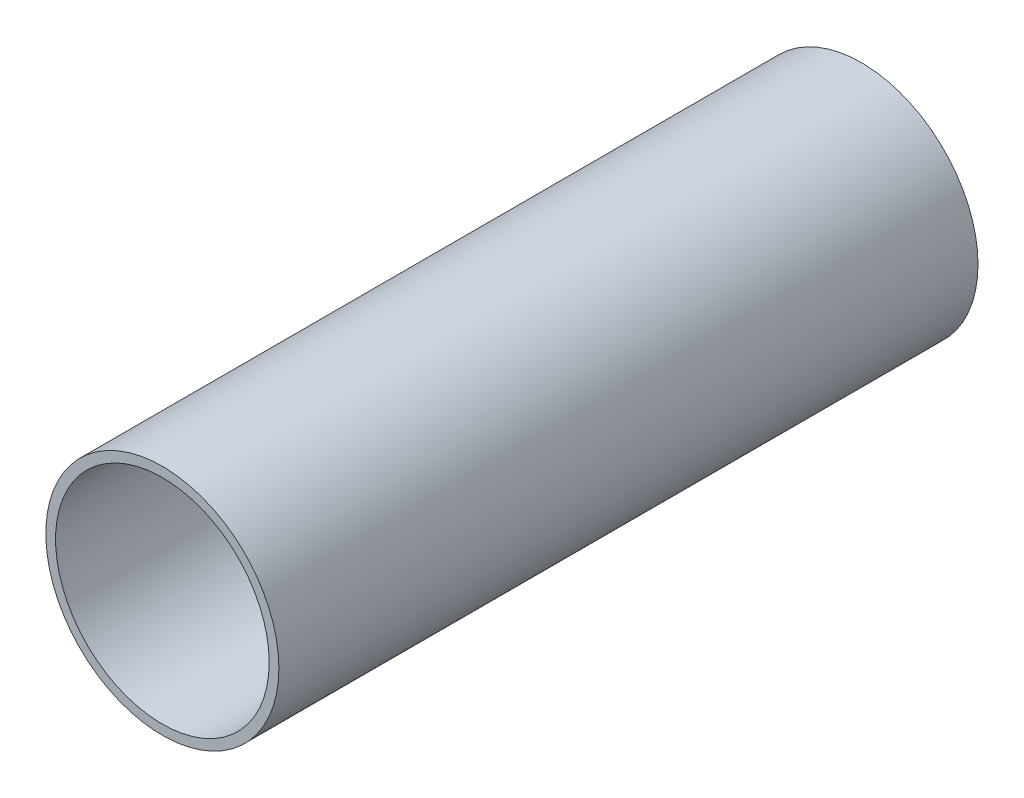
ISO-10303-21;
HEADER;
FILE_DESCRIPTION(('STEP AP214'),'2;1');
FILE_NAME('part.step','',(''),(''),'','','');
FILE_SCHEMA(('AUTOMOTIVE_DESIGN { 1 0 10303 214 1 1 1 1 }'));
ENDSEC;
DATA;
#1=APPLICATION_CONTEXT('core data for automotive mechanical design processes');
#2=APPLICATION_PROTOCOL_DEFINITION('international standard','automotive_design',2000,#1);
#3=PRODUCT_CONTEXT('',#1,'mechanical');
#4=PRODUCT('Part','Part','',(#3));
#5=PRODUCT_RELATED_PRODUCT_CATEGORY('part','',(#4));
#6=PRODUCT_DEFINITION_FORMATION('','',#4);
#7=PRODUCT_DEFINITION_CONTEXT('part definition',#1,'design');
#8=PRODUCT_DEFINITION('design','',#6,#7);
#9=PRODUCT_DEFINITION_SHAPE('','',#8);
#10=(LENGTH_UNIT() NAMED_UNIT(*) SI_UNIT(.MILLI.,.METRE.));
#11=(NAMED_UNIT(*) PLANE_ANGLE_UNIT() SI_UNIT($,.RADIAN.));
#12=(NAMED_UNIT(*) SI_UNIT($,.STERADIAN.) SOLID_ANGLE_UNIT());
#13=UNCERTAINTY_MEASURE_WITH_UNIT(LENGTH_MEASURE(1.E-05),#10,'distance_accuracy_value','');
#14=(GEOMETRIC_REPRESENTATION_CONTEXT(3) GLOBAL_UNCERTAINTY_ASSIGNED_CONTEXT((#13)) GLOBAL_UNIT_ASSIGNED_CONTEXT((#10,
#11,#12)) REPRESENTATION_CONTEXT('',''));
#15=CARTESIAN_POINT('',(0.,0.,0.));
#16=DIRECTION('',(0.,0.,1.));
#17=DIRECTION('',(1.,0.,0.));
#18=AXIS2_PLACEMENT_3D('',#15,#16,#17);
#19=CARTESIAN_POINT('',(0.,0.,228.6));
#20=DIRECTION('',(0.,0.,1.));
#21=DIRECTION('',(1.,0.,0.));
#22=AXIS2_PLACEMENT_3D('',#19,#20,#21);
#23=PLANE('',#22);
#24=CARTESIAN_POINT('',(0.,0.,228.6));
#25=DIRECTION('',(0.,0.,1.));
#26=DIRECTION('',(1.,0.,0.));
#27=AXIS2_PLACEMENT_3D('',#24,#25,#26);
#28=CIRCLE('',#27,38.1);
#29=CARTESIAN_POINT('',(38.1,0.,228.6));
#30=VERTEX_POINT('',#29);
#31=EDGE_CURVE('E10',#30,#30,#28,.T.);
#32=ORIENTED_EDGE('',*,*,#31,.T.);
#33=EDGE_LOOP('',(#32));
#34=FACE_BOUND('',#33,.T.);
#35=CARTESIAN_POINT('',(0.,0.,228.6));
#36=DIRECTION('',(0.,0.,1.));
#37=DIRECTION('',(1.,0.,0.));
#38=AXIS2_PLACEMENT_3D('',#35,#36,#37);
#39=CIRCLE('',#38,34.925);
#40=CARTESIAN_POINT('',(34.925,0.,228.6));
#41=VERTEX_POINT('',#40);
#42=EDGE_CURVE('E48',#41,#41,#39,.T.);
#43=ORIENTED_EDGE('',*,*,#42,.F.);
#44=EDGE_LOOP('',(#43));
#45=FACE_BOUND('',#44,.T.);
#46=ADVANCED_FACE('F30',(#34,#45),#23,.T.);
#47=CARTESIAN_POINT('',(0.,0.,0.));
#48=DIRECTION('',(0.,0.,1.));
#49=DIRECTION('',(1.,0.,0.));
#50=AXIS2_PLACEMENT_3D('',#47,#48,#49);
#51=PLANE('',#50);
#52=CARTESIAN_POINT('',(0.,0.,0.));
#53=DIRECTION('',(0.,0.,1.));
#54=DIRECTION('',(1.,0.,0.));
#55=AXIS2_PLACEMENT_3D('',#52,#53,#54);
#56=CIRCLE('',#55,38.1);
#57=CARTESIAN_POINT('',(38.1,0.,0.));
#58=VERTEX_POINT('',#57);
#59=EDGE_CURVE('E43',#58,#58,#56,.T.);
#60=ORIENTED_EDGE('',*,*,#59,.F.);
#61=EDGE_LOOP('',(#60));
#62=FACE_BOUND('',#61,.T.);
#63=CARTESIAN_POINT('',(0.,0.,0.));
#64=DIRECTION('',(0.,0.,1.));
#65=DIRECTION('',(1.,0.,0.));
#66=AXIS2_PLACEMENT_3D('',#63,#64,#65);
#67=CIRCLE('',#66,34.925);
#68=CARTESIAN_POINT('',(34.925,0.,0.));
#69=VERTEX_POINT('',#68);
#70=EDGE_CURVE('E51',#69,#69,#67,.T.);
#71=ORIENTED_EDGE('',*,*,#70,.T.);
#72=EDGE_LOOP('',(#71));
#73=FACE_BOUND('',#72,.T.);
#74=ADVANCED_FACE('F84',(#62,#73),#51,.F.);
#75=CARTESIAN_POINT('',(0.,0.,228.6));
#76=DIRECTION('',(0.,0.,-1.));
#77=DIRECTION('',(-1.,0.,0.));
#78=AXIS2_PLACEMENT_3D('',#75,#76,#77);
#79=CYLINDRICAL_SURFACE('',#78,38.1);
#80=CARTESIAN_POINT('',(0.,-38.1,73.6311199578352));
#81=CARTESIAN_POINT('',(-0.153999378052327,-38.1000006909333,73.5446645368232));
#82=CARTESIAN_POINT('',(-0.311575908863025,-38.0990649630533,73.4646590779705));
#83=CARTESIAN_POINT('',(-0.632872953058535,-38.0950819009941,73.3180411913921));
#84=CARTESIAN_POINT('',(-0.796594572800591,-38.0920341848326,73.2514311892327));
#85=CARTESIAN_POINT('',(-1.12905176057051,-38.0836304747435,73.1320723180007));
#86=CARTESIAN_POINT('',(-1.29778997944636,-38.0782732394959,73.0793309276057));
#87=CARTESIAN_POINT('',(-1.63904885419945,-38.0651110933928,72.9880964531141));
#88=CARTESIAN_POINT('',(-1.8115708515304,-38.0573053009703,72.949608511662));
#89=CARTESIAN_POINT('',(-2.15896002044526,-38.0391787479879,72.8871819588805));
#90=CARTESIAN_POINT('',(-2.33382530257213,-38.0288599105558,72.8632322707513));
#91=CARTESIAN_POINT('',(-2.68484040782847,-38.0056914098195,72.8299642402991));
#92=CARTESIAN_POINT('',(-2.86099068065575,-37.9928408151111,72.8206512940176));
#93=CARTESIAN_POINT('',(-3.21316536714221,-37.9646777614922,72.8166953335036));
#94=CARTESIAN_POINT('',(-3.38918979858104,-37.9493665877811,72.8220446842148));
#95=CARTESIAN_POINT('',(-3.74003345911291,-37.9163975996776,72.8473115973282));
#96=CARTESIAN_POINT('',(-3.91485221510293,-37.8987389137394,72.8672345828204));
#97=CARTESIAN_POINT('',(-4.26245012904982,-37.8612223228919,72.9215291311543));
#98=CARTESIAN_POINT('',(-4.43522298815622,-37.8413589528043,72.955937217845));
#99=CARTESIAN_POINT('',(-4.77715998610147,-37.7997145452739,73.0389278820598));
#100=CARTESIAN_POINT('',(-4.94632277795876,-37.7779328070738,73.0875156543764));
#101=CARTESIAN_POINT('',(-5.27979912379681,-37.7327712743174,73.1984646479457));
#102=CARTESIAN_POINT('',(-5.44411391484604,-37.7093918925719,73.2608223204544));
#103=CARTESIAN_POINT('',(-5.7669190811532,-37.6613765735234,73.398882592438));
#104=CARTESIAN_POINT('',(-5.92540725230392,-37.6367401689571,73.4745901804361));
#105=CARTESIAN_POINT('',(-6.23807992231855,-37.5861924166831,73.6401876820523));
#106=CARTESIAN_POINT('',(-6.39214702265679,-37.5602665863988,73.7302949319848));
#107=CARTESIAN_POINT('',(-6.69215631411518,-37.5079757415019,73.9231461647893));
#108=CARTESIAN_POINT('',(-6.83809545878242,-37.4816105669645,74.0258948401241));
#109=CARTESIAN_POINT('',(-7.12078614309139,-37.4289335803583,74.2432945780046));
#110=CARTESIAN_POINT('',(-7.25754013123958,-37.4026217558962,74.3579424476489));
#111=CARTESIAN_POINT('',(-7.52099553388245,-37.3505379339371,74.5983939857302));
#112=CARTESIAN_POINT('',(-7.64769320740442,-37.3247661399323,74.7242017691691));
#113=CARTESIAN_POINT('',(-8.01402776043891,-37.2484624086954,75.1200988035967));
#114=CARTESIAN_POINT('',(-8.23694111911041,-37.1995082175912,75.4063834490837));
#115=CARTESIAN_POINT('',(-8.63118525328118,-37.1100222125439,76.0134231874334));
#116=CARTESIAN_POINT('',(-8.80252058023413,-37.0694896555396,76.3341752353619));
#117=CARTESIAN_POINT('',(-9.08634477495745,-37.0009396354387,76.9968588792698));
#118=CARTESIAN_POINT('',(-9.1996316423023,-36.9727532777437,77.3384267716486));
#119=CARTESIAN_POINT('',(-9.32516654640346,-36.9412100478409,77.8616611028286));
#120=CARTESIAN_POINT('',(-9.3596169303931,-36.932483747788,78.0379554415339));
#121=CARTESIAN_POINT('',(-9.41349561652424,-36.9187873672256,78.3929680085238));
#122=CARTESIAN_POINT('',(-9.43292422268371,-36.9138172106974,78.5716861876791));
#123=CARTESIAN_POINT('',(-9.46764718341471,-36.9049397994026,79.0994140576313));
#124=CARTESIAN_POINT('',(-9.46178410124502,-36.9064499527265,79.4501574072559));
#125=CARTESIAN_POINT('',(-9.39255680426464,-36.9241252111711,80.1453356042854));
#126=CARTESIAN_POINT('',(-9.32919548164796,-36.9402895791765,80.4897707681067));
#127=CARTESIAN_POINT('',(-9.14785709918977,-36.9856093311491,81.1601609246861));
#128=CARTESIAN_POINT('',(-9.0303088354965,-37.0146626545687,81.486238856995));
#129=CARTESIAN_POINT('',(-8.7443852096004,-37.0832472464911,82.1140754105058));
#130=CARTESIAN_POINT('',(-8.57600410340545,-37.1227796990493,82.4158312784866));
#131=CARTESIAN_POINT('',(-8.18908611193499,-37.2100647418452,82.9935926993617));
#132=CARTESIAN_POINT('',(-7.9695435253692,-37.257976578916,83.2689004472914));
#133=CARTESIAN_POINT('',(-7.48848364695595,-37.3576343610282,83.7792150135895));
#134=CARTESIAN_POINT('',(-7.22696004329372,-37.4093808819805,84.014215760823));
#135=CARTESIAN_POINT('',(-6.66180262345533,-37.5141956078285,84.4432236929521));
#136=CARTESIAN_POINT('',(-6.35728256110621,-37.5672646458032,84.6360647086473));
#137=CARTESIAN_POINT('',(-5.7195314684234,-37.6696316412794,84.967748482377));
#138=CARTESIAN_POINT('',(-5.38629996172652,-37.7189295361866,85.1065903442789));
#139=CARTESIAN_POINT('',(-4.69974058689894,-37.8106129356152,85.3262225539002));
#140=CARTESIAN_POINT('',(-4.3463840862277,-37.8529882421628,85.4069278438228));
#141=CARTESIAN_POINT('',(-3.63012216349652,-37.928377198642,85.5071269839308));
#142=CARTESIAN_POINT('',(-3.26721782057237,-37.9613919016219,85.5266277219872));
#143=CARTESIAN_POINT('',(-2.54890542921028,-38.016320282055,85.503593190175));
#144=CARTESIAN_POINT('',(-2.19347684778802,-38.0384171792293,85.4621317967447));
#145=CARTESIAN_POINT('',(-1.49415960663936,-38.0723004457395,85.3200083997401));
#146=CARTESIAN_POINT('',(-1.1502701845108,-38.0840874975508,85.2193503155155));
#147=CARTESIAN_POINT('',(-0.488026852508964,-38.0982988830021,84.9631411670524));
#148=CARTESIAN_POINT('',(-0.169422000252762,-38.1008307585192,84.8082436831507));
#149=CARTESIAN_POINT('',(0.437634032442004,-38.098697208265,84.4477051456771));
#150=CARTESIAN_POINT('',(0.726084483562315,-38.0940316084576,84.2420628651889));
#151=CARTESIAN_POINT('',(1.26582056716772,-38.0799292743434,83.7849723258831));
#152=CARTESIAN_POINT('',(1.51695501608155,-38.0704737810151,83.5333464741751));
#153=CARTESIAN_POINT('',(1.97384478869089,-38.0495256726533,82.9916452718162));
#154=CARTESIAN_POINT('',(2.17959815701733,-38.0380329698795,82.7015682652531));
#155=CARTESIAN_POINT('',(2.45039481566481,-38.0212283194731,82.2429708149471));
#156=CARTESIAN_POINT('',(2.53462667505797,-38.0156768714179,82.0854825869865));
#157=CARTESIAN_POINT('',(2.6895340604357,-38.0050317848892,81.7639787390124));
#158=CARTESIAN_POINT('',(2.76021453192334,-37.9999379797634,81.5999655267423));
#159=CARTESIAN_POINT('',(2.88753597174662,-37.9904753261929,81.266501236459));
#160=CARTESIAN_POINT('',(2.94417182463346,-37.9861067420852,81.0970482024149));
#161=CARTESIAN_POINT('',(3.04295598768016,-37.9783211209706,80.7540142097206));
#162=CARTESIAN_POINT('',(3.08510969933637,-37.9749037292818,80.5804348159887));
#163=CARTESIAN_POINT('',(3.15465150399311,-37.9691900511137,80.2303217698206));
#164=CARTESIAN_POINT('',(3.18203931205294,-37.9668937862689,80.0537880604422));
#165=CARTESIAN_POINT('',(3.22184198507673,-37.9635369008799,79.6990950553072));
#166=CARTESIAN_POINT('',(3.23426240644717,-37.9624758217974,79.5209363875541));
#167=CARTESIAN_POINT('',(3.24405948604171,-37.961639882355,79.1641444799897));
#168=CARTESIAN_POINT('',(3.24143122130589,-37.9618654429006,78.9855111039886));
#169=CARTESIAN_POINT('',(3.22114249436632,-37.9635923494258,78.6291728140594));
#170=CARTESIAN_POINT('',(3.20348760808168,-37.9650932221757,78.4514675803326));
#171=CARTESIAN_POINT('',(3.15335083400245,-37.9692903272751,78.0986735027199));
#172=CARTESIAN_POINT('',(3.12090974217402,-37.9719832700521,77.9235788199462));
#173=CARTESIAN_POINT('',(3.04146227953345,-37.9784293099445,77.5768137906815));
#174=CARTESIAN_POINT('',(2.99446127085378,-37.9821820167247,77.4051422082625));
#175=CARTESIAN_POINT('',(2.88619613944338,-37.9905622305655,77.0662716237174));
#176=CARTESIAN_POINT('',(2.82492391852134,-37.9951902340313,76.8990752213133));
#177=CARTESIAN_POINT('',(2.68859234615582,-38.0050804128912,76.5704927274893));
#178=CARTESIAN_POINT('',(2.6135380130281,-38.010342357217,76.4091045466901));
#179=CARTESIAN_POINT('',(2.44991908445536,-38.0212392536823,76.0927449541293));
#180=CARTESIAN_POINT('',(2.36131583523157,-38.0268752460477,75.93779356746));
#181=CARTESIAN_POINT('',(2.17142053725815,-38.0381909866425,75.6359531433555));
#182=CARTESIAN_POINT('',(2.07013306934408,-38.0438707183842,75.4890612226928));
#183=CARTESIAN_POINT('',(1.85561481607758,-38.0549367857685,75.2043946672279));
#184=CARTESIAN_POINT('',(1.74239130755095,-38.0603232971702,75.0666145598281));
#185=CARTESIAN_POINT('',(1.5047875044797,-38.0704577953839,74.8010861816336));
#186=CARTESIAN_POINT('',(1.38040935709391,-38.0752059046441,74.6733359890194));
#187=CARTESIAN_POINT('',(1.06227236387619,-38.0856552035965,74.3729829759868));
#188=CARTESIAN_POINT('',(0.862710023250818,-38.0908058890111,74.206444683907));
#189=CARTESIAN_POINT('',(0.444670789149229,-38.0979777701363,73.8990060381876));
#190=CARTESIAN_POINT('',(0.226194012399342,-38.0999989851585,73.7581055263467));
#191=CARTESIAN_POINT('',(0.,-38.1,73.6311199578352));
#192=B_SPLINE_CURVE_WITH_KNOTS('',3,(#80,#81,#82,#83,#84,#85,#86,#87,#88,#89,#90,#91,#92,#93,
#94,#95,#96,#97,#98,#99,#100,#101,#102,#103,#104,#105,#106,#107,#108,#109,#110,#111,#112,#113,
#114,#115,#116,#117,#118,#119,#120,#121,#122,#123,#124,#125,#126,#127,#128,#129,#130,#131,#132,
#133,#134,#135,#136,#137,#138,#139,#140,#141,#142,#143,#144,#145,#146,#147,#148,#149,#150,#151,
#152,#153,#154,#155,#156,#157,#158,#159,#160,#161,#162,#163,#164,#165,#166,#167,#168,#169,#170,
#171,#172,#173,#174,#175,#176,#177,#178,#179,#180,#181,#182,#183,#184,#185,#186,#187,#188,#189,
#190,#191),.UNSPECIFIED.,.T.,.F.,(4,2,2,2,2,2,2,2,2,2,2,2,2,2,2,2,2,2,2,2,2,2,2,2,2,2,2,2,2,2,2,
2,2,2,2,2,2,2,2,2,2,2,2,2,2,2,2,2,2,2,2,2,2,2,2,4),(0.,0.529600927673914,1.05929766602483,
1.58927946137443,2.11945228829836,2.64922066406384,3.17918430064054,3.70887202318625,
4.23875695160836,4.76998605184196,5.30141001511656,5.8326971806578,6.36418329701175,
6.90461852167121,7.44525496311512,7.98574670923578,8.52643858628468,9.61902699166447,
10.7115189543524,11.7885596948404,12.3274903040822,12.8664100059015,13.9132926300962,
14.9601225984213,15.9988072778133,17.0376093700998,18.0988713033108,19.16029294617,
20.2481384826609,21.3360020715139,22.4254540646015,23.5147834479539,24.5851522161598,
25.6554501243706,26.7132712916366,27.7711180375861,28.8331401131608,29.8952079399513,
30.4307414563624,30.9660791592473,31.5016115618737,32.0369440061732,32.5722867805243,
33.1074307560216,33.6427498061278,34.1778703022857,34.7115232259393,35.2449798488446,
35.7787399220914,36.3123060276628,36.8474237691893,37.3823488102231,37.9169495989458,
38.4514477022155,39.2293294023994,40.0072063023975),.UNSPECIFIED.);
#193=CARTESIAN_POINT('',(0.,-38.1,73.6311199578352));
#194=VERTEX_POINT('',#193);
#195=EDGE_CURVE('E74',#194,#194,#192,.T.);
#196=ORIENTED_EDGE('',*,*,#195,.T.);
#197=EDGE_LOOP('',(#196));
#198=FACE_BOUND('',#197,.T.);
#199=CARTESIAN_POINT('',(0.,-38.1,149.831119957835));
#200=CARTESIAN_POINT('',(-0.153999378052327,-38.1000006909333,149.744664536823));
#201=CARTESIAN_POINT('',(-0.311575908863022,-38.0990649630533,149.66465907797));
#202=CARTESIAN_POINT('',(-0.632872953058529,-38.0950819009941,149.518041191392));
#203=CARTESIAN_POINT('',(-0.796594572800584,-38.0920341848326,149.451431189233));
#204=CARTESIAN_POINT('',(-1.12905176057051,-38.0836304747435,149.332072318001));
#205=CARTESIAN_POINT('',(-1.29778997944636,-38.0782732394959,149.279330927606));
#206=CARTESIAN_POINT('',(-1.63904885419944,-38.0651110933928,149.188096453114));
#207=CARTESIAN_POINT('',(-1.8115708515304,-38.0573053009703,149.149608511662));
#208=CARTESIAN_POINT('',(-2.15896002044526,-38.0391787479879,149.08718195888));
#209=CARTESIAN_POINT('',(-2.33382530257212,-38.0288599105558,149.063232270751));
#210=CARTESIAN_POINT('',(-2.68484040782846,-38.0056914098195,149.029964240299));
#211=CARTESIAN_POINT('',(-2.86099068065574,-37.9928408151111,149.020651294018));
#212=CARTESIAN_POINT('',(-3.21316536714221,-37.9646777614923,149.016695333504));
#213=CARTESIAN_POINT('',(-3.38918979858104,-37.9493665877811,149.022044684215));
#214=CARTESIAN_POINT('',(-3.74003345911291,-37.9163975996776,149.047311597328));
#215=CARTESIAN_POINT('',(-3.91485221510293,-37.8987389137394,149.06723458282));
#216=CARTESIAN_POINT('',(-4.26245012904982,-37.8612223228919,149.121529131154));
#217=CARTESIAN_POINT('',(-4.43522298815622,-37.8413589528043,149.155937217845));
#218=CARTESIAN_POINT('',(-4.77715998610147,-37.7997145452739,149.23892788206));
#219=CARTESIAN_POINT('',(-4.94632277795877,-37.7779328070738,149.287515654376));
#220=CARTESIAN_POINT('',(-5.27979912379681,-37.7327712743174,149.398464647946));
#221=CARTESIAN_POINT('',(-5.44411391484603,-37.7093918925719,149.460822320454));
#222=CARTESIAN_POINT('',(-5.76691908115319,-37.6613765735234,149.598882592438));
#223=CARTESIAN_POINT('',(-5.92540725230391,-37.6367401689571,149.674590180436));
#224=CARTESIAN_POINT('',(-6.23807992231855,-37.5861924166831,149.840187682052));
#225=CARTESIAN_POINT('',(-6.39214702265678,-37.5602665863988,149.930294931985));
#226=CARTESIAN_POINT('',(-6.69215631411516,-37.5079757415019,150.123146164789));
#227=CARTESIAN_POINT('',(-6.83809545878241,-37.4816105669645,150.225894840124));
#228=CARTESIAN_POINT('',(-7.12078614309138,-37.4289335803583,150.443294578005));
#229=CARTESIAN_POINT('',(-7.25754013123957,-37.4026217558962,150.557942447649));
#230=CARTESIAN_POINT('',(-7.52099553388244,-37.3505379339371,150.79839398573));
#231=CARTESIAN_POINT('',(-7.64769320740442,-37.3247661399323,150.924201769169));
#232=CARTESIAN_POINT('',(-8.01402776043892,-37.2484624086954,151.320098803597));
#233=CARTESIAN_POINT('',(-8.23694111911044,-37.1995082175912,151.606383449084));
#234=CARTESIAN_POINT('',(-8.6311852532812,-37.1100222125439,152.213423187434));
#235=CARTESIAN_POINT('',(-8.80252058023414,-37.0694896555396,152.534175235362));
#236=CARTESIAN_POINT('',(-9.08634477495745,-37.0009396354387,153.19685887927));
#237=CARTESIAN_POINT('',(-9.1996316423023,-36.9727532777436,153.538426771649));
#238=CARTESIAN_POINT('',(-9.32516654640346,-36.9412100478409,154.061661102829));
#239=CARTESIAN_POINT('',(-9.3596169303931,-36.932483747788,154.237955441534));
#240=CARTESIAN_POINT('',(-9.41349561652424,-36.9187873672256,154.592968008524));
#241=CARTESIAN_POINT('',(-9.43292422268371,-36.9138172106974,154.771686187679));
#242=CARTESIAN_POINT('',(-9.46764718341471,-36.9049397994026,155.299414057631));
#243=CARTESIAN_POINT('',(-9.46178410124502,-36.9064499527265,155.650157407256));
#244=CARTESIAN_POINT('',(-9.39255680426464,-36.9241252111711,156.345335604285));
#245=CARTESIAN_POINT('',(-9.32919548164796,-36.9402895791765,156.689770768107));
#246=CARTESIAN_POINT('',(-9.14785709918978,-36.9856093311491,157.360160924686));
#247=CARTESIAN_POINT('',(-9.03030883549652,-37.0146626545687,157.686238856995));
#248=CARTESIAN_POINT('',(-8.74438520960041,-37.0832472464911,158.314075410506));
#249=CARTESIAN_POINT('',(-8.57600410340544,-37.1227796990493,158.615831278487));
#250=CARTESIAN_POINT('',(-8.18908611193498,-37.2100647418452,159.193592699362));
#251=CARTESIAN_POINT('',(-7.96954352536919,-37.257976578916,159.468900447291));
#252=CARTESIAN_POINT('',(-7.48848364695595,-37.3576343610282,159.97921501359));
#253=CARTESIAN_POINT('',(-7.22696004329373,-37.4093808819805,160.214215760823));
#254=CARTESIAN_POINT('',(-6.66180262345534,-37.5141956078285,160.643223692952));
#255=CARTESIAN_POINT('',(-6.35728256110623,-37.5672646458032,160.836064708647));
#256=CARTESIAN_POINT('',(-5.71953146842341,-37.6696316412794,161.167748482377));
#257=CARTESIAN_POINT('',(-5.38629996172652,-37.7189295361866,161.306590344279));
#258=CARTESIAN_POINT('',(-4.69974058689894,-37.8106129356152,161.5262225539));
#259=CARTESIAN_POINT('',(-4.34638408622769,-37.8529882421628,161.606927843823));
#260=CARTESIAN_POINT('',(-3.63012216349652,-37.928377198642,161.707126983931));
#261=CARTESIAN_POINT('',(-3.26721782057237,-37.9613919016219,161.726627721987));
#262=CARTESIAN_POINT('',(-2.54890542921028,-38.016320282055,161.703593190175));
#263=CARTESIAN_POINT('',(-2.19347684778801,-38.0384171792293,161.662131796745));
#264=CARTESIAN_POINT('',(-1.49415960663936,-38.0723004457395,161.52000839974));
#265=CARTESIAN_POINT('',(-1.1502701845108,-38.0840874975508,161.419350315515));
#266=CARTESIAN_POINT('',(-0.488026852508964,-38.0982988830021,161.163141167052));
#267=CARTESIAN_POINT('',(-0.169422000252754,-38.1008307585192,161.008243683151));
#268=CARTESIAN_POINT('',(0.437634032442012,-38.098697208265,160.647705145677));
#269=CARTESIAN_POINT('',(0.726084483562316,-38.0940316084576,160.442062865189));
#270=CARTESIAN_POINT('',(1.26582056716772,-38.0799292743434,159.984972325883));
#271=CARTESIAN_POINT('',(1.51695501608155,-38.0704737810151,159.733346474175));
#272=CARTESIAN_POINT('',(1.97384478869088,-38.0495256726533,159.191645271816));
#273=CARTESIAN_POINT('',(2.17959815701732,-38.0380329698795,158.901568265253));
#274=CARTESIAN_POINT('',(2.4503948156648,-38.0212283194731,158.442970814947));
#275=CARTESIAN_POINT('',(2.53462667505796,-38.0156768714179,158.285482586987));
#276=CARTESIAN_POINT('',(2.6895340604357,-38.0050317848892,157.963978739012));
#277=CARTESIAN_POINT('',(2.76021453192334,-37.9999379797634,157.799965526742));
#278=CARTESIAN_POINT('',(2.88753597174663,-37.9904753261929,157.466501236459));
#279=CARTESIAN_POINT('',(2.94417182463347,-37.9861067420852,157.297048202415));
#280=CARTESIAN_POINT('',(3.04295598768016,-37.9783211209706,156.954014209721));
#281=CARTESIAN_POINT('',(3.08510969933637,-37.9749037292818,156.780434815989));
#282=CARTESIAN_POINT('',(3.15465150399312,-37.9691900511137,156.430321769821));
#283=CARTESIAN_POINT('',(3.18203931205295,-37.9668937862689,156.253788060442));
#284=CARTESIAN_POINT('',(3.22184198507674,-37.9635369008799,155.899095055307));
#285=CARTESIAN_POINT('',(3.23426240644717,-37.9624758217974,155.720936387554));
#286=CARTESIAN_POINT('',(3.2440594860417,-37.961639882355,155.36414447999));
#287=CARTESIAN_POINT('',(3.24143122130588,-37.9618654429006,155.185511103989));
#288=CARTESIAN_POINT('',(3.22114249436632,-37.9635923494257,154.829172814059));
#289=CARTESIAN_POINT('',(3.20348760808167,-37.9650932221757,154.651467580333));
#290=CARTESIAN_POINT('',(3.15335083400245,-37.9692903272751,154.29867350272));
#291=CARTESIAN_POINT('',(3.12090974217402,-37.9719832700521,154.123578819946));
#292=CARTESIAN_POINT('',(3.04146227953345,-37.9784293099445,153.776813790681));
#293=CARTESIAN_POINT('',(2.99446127085377,-37.9821820167247,153.605142208262));
#294=CARTESIAN_POINT('',(2.88619613944338,-37.9905622305655,153.266271623717));
#295=CARTESIAN_POINT('',(2.82492391852134,-37.9951902340313,153.099075221313));
#296=CARTESIAN_POINT('',(2.68859234615582,-38.0050804128912,152.770492727489));
#297=CARTESIAN_POINT('',(2.61353801302811,-38.010342357217,152.60910454669));
#298=CARTESIAN_POINT('',(2.44991908445537,-38.0212392536823,152.292744954129));
#299=CARTESIAN_POINT('',(2.36131583523158,-38.0268752460477,152.13779356746));
#300=CARTESIAN_POINT('',(2.17142053725817,-38.0381909866425,151.835953143356));
#301=CARTESIAN_POINT('',(2.07013306934409,-38.0438707183842,151.689061222693));
#302=CARTESIAN_POINT('',(1.85561481607758,-38.0549367857685,151.404394667228));
#303=CARTESIAN_POINT('',(1.74239130755096,-38.0603232971702,151.266614559828));
#304=CARTESIAN_POINT('',(1.5047875044797,-38.0704577953839,151.001086181634));
#305=CARTESIAN_POINT('',(1.38040935709391,-38.0752059046441,150.873335989019));
#306=CARTESIAN_POINT('',(1.06227236387618,-38.0856552035965,150.572982975987));
#307=CARTESIAN_POINT('',(0.862710023250821,-38.0908058890111,150.406444683907));
#308=CARTESIAN_POINT('',(0.444670789149235,-38.0979777701363,150.099006038188));
#309=CARTESIAN_POINT('',(0.226194012399344,-38.0999989851585,149.958105526347));
#310=CARTESIAN_POINT('',(0.,-38.1,149.831119957835));
#311=B_SPLINE_CURVE_WITH_KNOTS('',3,(#199,#200,#201,#202,#203,#204,#205,#206,#207,#208,#209,
#210,#211,#212,#213,#214,#215,#216,#217,#218,#219,#220,#221,#222,#223,#224,#225,#226,#227,#228,
#229,#230,#231,#232,#233,#234,#235,#236,#237,#238,#239,#240,#241,#242,#243,#244,#245,#246,#247,
#248,#249,#250,#251,#252,#253,#254,#255,#256,#257,#258,#259,#260,#261,#262,#263,#264,#265,#266,
#267,#268,#269,#270,#271,#272,#273,#274,#275,#276,#277,#278,#279,#280,#281,#282,#283,#284,#285,
#286,#287,#288,#289,#290,#291,#292,#293,#294,#295,#296,#297,#298,#299,#300,#301,#302,#303,#304,
#305,#306,#307,#308,#309,#310),.UNSPECIFIED.,.T.,.F.,(4,2,2,2,2,2,2,2,2,2,2,2,2,2,2,2,2,2,2,2,2,
2,2,2,2,2,2,2,2,2,2,2,2,2,2,2,2,2,2,2,2,2,2,2,2,2,2,2,2,2,2,2,2,2,2,4),(0.,0.529600927673908,
1.05929766602483,1.58927946137442,2.11945228829836,2.64922066406384,3.17918430064054,
3.70887202318625,4.23875695160837,4.76998605184196,5.30141001511656,5.83269718065779,
6.36418329701174,6.9046185216712,7.44525496311511,7.98574670923578,8.52643858628467,
9.61902699166453,10.7115189543524,11.7885596948404,12.3274903040822,12.8664100059015,
13.9132926300962,14.9601225984213,15.9988072778133,17.0376093700998,18.0988713033108,
19.16029294617,20.2481384826609,21.3360020715139,22.4254540646015,23.5147834479539,
24.5851522161598,25.6554501243706,26.7132712916366,27.7711180375861,28.8331401131608,
29.8952079399513,30.4307414563624,30.9660791592473,31.5016115618737,32.0369440061732,
32.5722867805243,33.1074307560217,33.6427498061279,34.1778703022857,34.7115232259394,
35.2449798488446,35.7787399220915,36.3123060276628,36.8474237691893,37.3823488102231,
37.9169495989458,38.4514477022155,39.2293294023994,40.0072063023974),.UNSPECIFIED.);
#312=CARTESIAN_POINT('',(0.,-38.1,149.831119957835));
#313=VERTEX_POINT('',#312);
#314=EDGE_CURVE('E58',#313,#313,#311,.T.);
#315=ORIENTED_EDGE('',*,*,#314,.T.);
#316=EDGE_LOOP('',(#315));
#317=FACE_BOUND('',#316,.T.);
#318=ORIENTED_EDGE('',*,*,#31,.F.);
#319=EDGE_LOOP('',(#318));
#320=FACE_BOUND('',#319,.T.);
#321=ORIENTED_EDGE('',*,*,#59,.T.);
#322=EDGE_LOOP('',(#321));
#323=FACE_BOUND('',#322,.T.);
#324=ADVANCED_FACE('F32',(#198,#317,#320,#323),#79,.T.);
#325=CARTESIAN_POINT('',(0.,0.,228.6));
#326=DIRECTION('',(0.,0.,-1.));
#327=DIRECTION('',(-1.,0.,0.));
#328=AXIS2_PLACEMENT_3D('',#325,#326,#327);
#329=CYLINDRICAL_SURFACE('',#328,34.925);
#330=CARTESIAN_POINT('',(-3.10844731158333,-34.7863936088683,85.5182722323451));
#331=CARTESIAN_POINT('',(-2.93286935367937,-34.8020846588809,85.5182758055949));
#332=CARTESIAN_POINT('',(-2.75721643109621,-34.8164368059793,85.510988558692));
#333=CARTESIAN_POINT('',(-2.40686855884201,-34.842408477342,85.4818425601068));
#334=CARTESIAN_POINT('',(-2.23217375548544,-34.8540275950022,85.4599816420924));
#335=CARTESIAN_POINT('',(-1.88497787954024,-34.8745286962189,85.4017805610833));
#336=CARTESIAN_POINT('',(-1.71247779108713,-34.8834094906645,85.3654341234452));
#337=CARTESIAN_POINT('',(-1.37092454967681,-34.8985017041983,85.2784750517905));
#338=CARTESIAN_POINT('',(-1.20187265860029,-34.9047121621886,85.2278572921251));
#339=CARTESIAN_POINT('',(-0.868623783414733,-34.9145942257443,85.1127440758888));
#340=CARTESIAN_POINT('',(-0.704423370109893,-34.9182676677509,85.0482587019463));
#341=CARTESIAN_POINT('',(-0.381867232043084,-34.9232849548407,84.90581141943));
#342=CARTESIAN_POINT('',(-0.223513691258455,-34.9246279378753,84.8278445356993));
#343=CARTESIAN_POINT('',(0.0860855781755901,-34.9252368689713,84.6590401461799));
#344=CARTESIAN_POINT('',(0.237334563603256,-34.9245037783545,84.5682086158447));
#345=CARTESIAN_POINT('',(0.531793525045785,-34.9212616050286,84.374253379853));
#346=CARTESIAN_POINT('',(0.675000487516499,-34.918751861294,84.2711251109244));
#347=CARTESIAN_POINT('',(0.952631136453228,-34.9122821809932,84.0530821493493));
#348=CARTESIAN_POINT('',(1.08703418612034,-34.9083189713963,83.93814127993));
#349=CARTESIAN_POINT('',(1.34581666586423,-34.8993005034099,83.697430188677));
#350=CARTESIAN_POINT('',(1.47019238945247,-34.8942448437267,83.5716559976371));
#351=CARTESIAN_POINT('',(1.7079707364105,-34.8834147561871,83.3102316371936));
#352=CARTESIAN_POINT('',(1.82137674963956,-34.8776405516447,83.1745845415679));
#353=CARTESIAN_POINT('',(2.03651974712285,-34.8657400276403,82.894267721879));
#354=CARTESIAN_POINT('',(2.13825238845367,-34.8596135783946,82.7495946705302));
#355=CARTESIAN_POINT('',(2.33015212887761,-34.8473147852243,82.4509416879193));
#356=CARTESIAN_POINT('',(2.42020805464995,-34.8411425189723,82.2968902935472));
#357=CARTESIAN_POINT('',(2.58707618137914,-34.8291496046007,81.9816916117452));
#358=CARTESIAN_POINT('',(2.66388345206216,-34.8233290879001,81.8205417106054));
#359=CARTESIAN_POINT('',(2.8036433324983,-34.8123560957814,81.4923765728597));
#360=CARTESIAN_POINT('',(2.86660105838457,-34.8072033739644,81.3253635286731));
#361=CARTESIAN_POINT('',(2.97826523170848,-34.7978254531377,80.9865958467936));
#362=CARTESIAN_POINT('',(3.02696642980004,-34.7936005959163,80.8148394879911));
#363=CARTESIAN_POINT('',(3.15109551907155,-34.782660727478,80.2941734112572));
#364=CARTESIAN_POINT('',(3.20461231854389,-34.7776750724069,79.9397174742348));
#365=CARTESIAN_POINT('',(3.25132966807831,-34.773337237513,79.2270150728471));
#366=CARTESIAN_POINT('',(3.24453176936283,-34.7739849128077,78.8687687062038));
#367=CARTESIAN_POINT('',(3.17105016206676,-34.7807619321731,78.1599001430402));
#368=CARTESIAN_POINT('',(3.10460059184435,-34.786869843918,77.8092536225039));
#369=CARTESIAN_POINT('',(2.91404197206564,-34.8033481603073,77.1241114837786));
#370=CARTESIAN_POINT('',(2.78993147270314,-34.8137186721281,76.7896162719258));
#371=CARTESIAN_POINT('',(2.48729340501724,-34.8366467054554,76.145519363575));
#372=CARTESIAN_POINT('',(2.30866190837967,-34.8492083840116,75.8359666496368));
#373=CARTESIAN_POINT('',(1.90206891140609,-34.8737594677351,75.251120758016));
#374=CARTESIAN_POINT('',(1.67410608497868,-34.8857488575081,74.9758285016133));
#375=CARTESIAN_POINT('',(1.17445401594177,-34.9061432576637,74.4664744701856));
#376=CARTESIAN_POINT('',(0.902635811151181,-34.9145374212804,74.2325386967961));
#377=CARTESIAN_POINT('',(0.323464824965653,-34.9247006710472,73.8136305768572));
#378=CARTESIAN_POINT('',(0.0161139117902136,-34.9264701053456,73.628655657751));
#379=CARTESIAN_POINT('',(-0.623235333114619,-34.9208913977295,73.3140110844375));
#380=CARTESIAN_POINT('',(-0.955067175204064,-34.9136003111614,73.1840021845153));
#381=CARTESIAN_POINT('',(-1.63540818486814,-34.888347637679,72.9813022720955));
#382=CARTESIAN_POINT('',(-1.98391617472158,-34.8703868032756,72.9086072182351));
#383=CARTESIAN_POINT('',(-2.68443277886314,-34.8234366329628,72.8226997052528));
#384=CARTESIAN_POINT('',(-3.03638820427195,-34.7945402233127,72.8089977646138));
#385=CARTESIAN_POINT('',(-3.73689288865681,-34.7262851689457,72.8397401880663));
#386=CARTESIAN_POINT('',(-4.08544202474317,-34.6869261482001,72.8841866422496));
#387=CARTESIAN_POINT('',(-4.59935265688958,-34.6212655333513,72.9932557528236));
#388=CARTESIAN_POINT('',(-4.76984399286726,-34.5981676174149,73.0369433672768));
#389=CARTESIAN_POINT('',(-5.10636266601752,-34.5501009227058,73.1382099162554));
#390=CARTESIAN_POINT('',(-5.27239151310706,-34.5251327878459,73.1957840846858));
#391=CARTESIAN_POINT('',(-5.59897131436914,-34.4736785810515,73.324418909052));
#392=CARTESIAN_POINT('',(-5.75951970722288,-34.4471918144617,73.3954857717537));
#393=CARTESIAN_POINT('',(-6.07398652991109,-34.3931352485487,73.5505506276956));
#394=CARTESIAN_POINT('',(-6.22790719100827,-34.3655658197814,73.6345442248251));
#395=CARTESIAN_POINT('',(-6.53147335912401,-34.309180042609,73.8168777077695));
#396=CARTESIAN_POINT('',(-6.68095229871602,-34.2803496125641,73.9154906392387));
#397=CARTESIAN_POINT('',(-6.97098248008389,-34.2225494267917,74.1249294144036));
#398=CARTESIAN_POINT('',(-7.11153682300615,-34.1935797232652,74.2357509787894));
#399=CARTESIAN_POINT('',(-7.38290294010321,-34.1360164703414,74.4689584342002));
#400=CARTESIAN_POINT('',(-7.51371008212088,-34.1074231050389,74.5913497616269));
#401=CARTESIAN_POINT('',(-7.76457033850036,-34.0511907848381,74.8468079147662));
#402=CARTESIAN_POINT('',(-7.88462747093491,-34.0235514757324,74.9798707162097));
#403=CARTESIAN_POINT('',(-8.11436968114143,-33.9694966369549,75.2572618290319));
#404=CARTESIAN_POINT('',(-8.22393624894075,-33.9430964966998,75.401691354269));
#405=CARTESIAN_POINT('',(-8.43043300890297,-33.8923992604934,75.6995837128159));
#406=CARTESIAN_POINT('',(-8.5273681170448,-33.8681013476308,75.8530429979195));
#407=CARTESIAN_POINT('',(-8.70792032616027,-33.822129353842,76.1680444263615));
#408=CARTESIAN_POINT('',(-8.79153356120755,-33.8004560349934,76.3295888981643));
#409=CARTESIAN_POINT('',(-8.94468685872752,-33.7602498909894,76.659513823472));
#410=CARTESIAN_POINT('',(-9.01423284395373,-33.7417157446807,76.8278913640392));
#411=CARTESIAN_POINT('',(-9.13737035318762,-33.7085756047686,77.1666781813149));
#412=CARTESIAN_POINT('',(-9.19126934551091,-33.693894545811,77.3369683634415));
#413=CARTESIAN_POINT('',(-9.28456466515011,-33.6683059646619,77.6816844363193));
#414=CARTESIAN_POINT('',(-9.32396676832199,-33.6573969397198,77.8561086504405));
#415=CARTESIAN_POINT('',(-9.38794278962369,-33.6396084965941,78.2078597913961));
#416=CARTESIAN_POINT('',(-9.41251669979064,-33.6327290805746,78.3851867197891));
#417=CARTESIAN_POINT('',(-9.44660819743889,-33.6231696058076,78.7413934075497));
#418=CARTESIAN_POINT('',(-9.4561261287047,-33.6204894511752,78.9202731313673));
#419=CARTESIAN_POINT('',(-9.45995517380743,-33.6194121576786,79.2724280588911));
#420=CARTESIAN_POINT('',(-9.45474715832096,-33.6208795804891,79.4456978198456));
#421=CARTESIAN_POINT('',(-9.4301914794295,-33.6277753700275,79.7912137074664));
#422=CARTESIAN_POINT('',(-9.41083896554509,-33.6332050955206,79.9634594625446));
#423=CARTESIAN_POINT('',(-9.35816792542403,-33.6478983461486,80.305564658002));
#424=CARTESIAN_POINT('',(-9.32485488353023,-33.6571603657625,80.4754250084261));
#425=CARTESIAN_POINT('',(-9.24453253377276,-33.6793108140491,80.8116993611767));
#426=CARTESIAN_POINT('',(-9.19751812566481,-33.6922005930702,80.9781120553833));
#427=CARTESIAN_POINT('',(-9.09036751548477,-33.7212679338877,81.305732268258));
#428=CARTESIAN_POINT('',(-9.03027616061382,-33.7374342461601,81.4669554666308));
#429=CARTESIAN_POINT('',(-8.89733016988226,-33.7727385521756,81.7837757376769));
#430=CARTESIAN_POINT('',(-8.82447116940943,-33.7918775618785,81.9393708643825));
#431=CARTESIAN_POINT('',(-8.66655858362446,-33.8327213523584,82.2438715636001));
#432=CARTESIAN_POINT('',(-8.5815061023464,-33.8544259008127,82.3927777401482));
#433=CARTESIAN_POINT('',(-8.39980852003099,-33.8999647591276,82.6829997729479));
#434=CARTESIAN_POINT('',(-8.30316303778138,-33.9237991390168,82.8243153793777));
#435=CARTESIAN_POINT('',(-8.09593613480813,-33.973859551321,83.1025344613678));
#436=CARTESIAN_POINT('',(-7.98502859786933,-34.00013528917,83.2391861711811));
#437=CARTESIAN_POINT('',(-7.75243366350348,-34.0539225000409,83.5026418609062));
#438=CARTESIAN_POINT('',(-7.63074957273666,-34.08143359274,83.6294488393016));
#439=CARTESIAN_POINT('',(-7.37730052896286,-34.1371923986005,83.8725517168475));
#440=CARTESIAN_POINT('',(-7.24552910001314,-34.1654405771613,83.9888407573384));
#441=CARTESIAN_POINT('',(-6.97288003865497,-34.2221265792322,84.2100444772245));
#442=CARTESIAN_POINT('',(-6.83200556418916,-34.2505643339385,84.3149630676922));
#443=CARTESIAN_POINT('',(-6.53801801061952,-34.3079142498444,84.5155210458863));
#444=CARTESIAN_POINT('',(-6.38467493042147,-34.336817957044,84.6108259919819));
#445=CARTESIAN_POINT('',(-6.0703702237882,-34.3937745779414,84.788063520398));
#446=CARTESIAN_POINT('',(-5.90941128957751,-34.4218277866232,84.8700007833381));
#447=CARTESIAN_POINT('',(-5.58099733035959,-34.4765975212361,85.0199003428677));
#448=CARTESIAN_POINT('',(-5.41354604086931,-34.5033147961427,85.0878705379335));
#449=CARTESIAN_POINT('',(-5.07327324046287,-34.55498753855,85.2093487993583));
#450=CARTESIAN_POINT('',(-4.90045275792271,-34.5799433404709,85.2628596163521));
#451=CARTESIAN_POINT('',(-4.46264110179484,-34.6397267684232,85.3781411624449));
#452=CARTESIAN_POINT('',(-4.19494543346863,-34.6732185237698,85.4305657492587));
#453=CARTESIAN_POINT('',(-3.65437588983338,-34.7343506223142,85.5006277010189));
#454=CARTESIAN_POINT('',(-3.38150225467044,-34.7619912361598,85.5182666753064));
#455=CARTESIAN_POINT('',(-3.10844731158333,-34.7863936088683,85.5182722323451));
#456=B_SPLINE_CURVE_WITH_KNOTS('',3,(#330,#331,#332,#333,#334,#335,#336,#337,#338,#339,#340,
#341,#342,#343,#344,#345,#346,#347,#348,#349,#350,#351,#352,#353,#354,#355,#356,#357,#358,#359,
#360,#361,#362,#363,#364,#365,#366,#367,#368,#369,#370,#371,#372,#373,#374,#375,#376,#377,#378,
#379,#380,#381,#382,#383,#384,#385,#386,#387,#388,#389,#390,#391,#392,#393,#394,#395,#396,#397,
#398,#399,#400,#401,#402,#403,#404,#405,#406,#407,#408,#409,#410,#411,#412,#413,#414,#415,#416,
#417,#418,#419,#420,#421,#422,#423,#424,#425,#426,#427,#428,#429,#430,#431,#432,#433,#434,#435,
#436,#437,#438,#439,#440,#441,#442,#443,#444,#445,#446,#447,#448,#449,#450,#451,#452,#453,#454,
#455),.UNSPECIFIED.,.T.,.F.,(4,2,2,2,2,2,2,2,2,2,2,2,2,2,2,2,2,2,2,2,2,2,2,2,2,2,2,2,2,2,2,2,2,
2,2,2,2,2,2,2,2,2,2,2,2,2,2,2,2,2,2,2,2,2,2,2,2,2,2,2,2,2,4),(0.,0.528599473499212,
1.05727753923542,1.58618485999539,2.11528238417129,2.64399651394178,3.17290617609066,
3.70157096770559,4.23043255896011,4.76049246998973,5.29074742186555,5.82083798737247,
6.35112513098189,6.88613903473048,7.42135160776605,7.95636613572145,8.49157741242625,
9.56151945387435,10.631433977763,11.697167261545,12.7629273432015,13.8307318084442,
14.89856498125,15.9695974839866,17.0405737001443,18.1048398756281,19.1690309999534,
20.2243750219126,21.2797569783066,21.8117826920467,22.3436260649556,22.8757146861877,
23.4076227534873,23.9511370562273,24.4944614515441,25.0380424253478,25.5814193671781,
26.1303482571042,26.6790628698085,27.2279364272606,27.776578408486,28.313568484558,
28.8503443805646,29.3871205648237,29.9238844922908,30.4433249068855,30.9629435333762,
31.4823582206454,32.0019665041525,32.5198201190266,33.0378511084349,33.5558352233624,
34.0738363758157,34.6070627527288,35.1401260784784,35.673534541312,36.2067589423633,
36.7546441398806,37.3023370848086,37.8497194479051,38.3969976079978,39.2191018118223,
40.041167980465),.UNSPECIFIED.);
#457=CARTESIAN_POINT('',(-3.10844731158333,-34.7863936088683,85.5182722323451));
#458=VERTEX_POINT('',#457);
#459=EDGE_CURVE('E35',#458,#458,#456,.T.);
#460=ORIENTED_EDGE('',*,*,#459,.F.);
#461=EDGE_LOOP('',(#460));
#462=FACE_BOUND('',#461,.T.);
#463=CARTESIAN_POINT('',(-3.10844731158333,-34.7863936088683,161.718272232345));
#464=CARTESIAN_POINT('',(-2.93286935367937,-34.8020846588809,161.718275805595));
#465=CARTESIAN_POINT('',(-2.75721643109622,-34.8164368059793,161.710988558692));
#466=CARTESIAN_POINT('',(-2.40686855884201,-34.842408477342,161.681842560107));
#467=CARTESIAN_POINT('',(-2.23217375548544,-34.8540275950022,161.659981642092));
#468=CARTESIAN_POINT('',(-1.88497787954024,-34.8745286962189,161.601780561083));
#469=CARTESIAN_POINT('',(-1.71247779108713,-34.8834094906645,161.565434123445));
#470=CARTESIAN_POINT('',(-1.37092454967681,-34.8985017041983,161.47847505179));
#471=CARTESIAN_POINT('',(-1.2018726586003,-34.9047121621886,161.427857292125));
#472=CARTESIAN_POINT('',(-0.86862378341474,-34.9145942257443,161.312744075889));
#473=CARTESIAN_POINT('',(-0.704423370109901,-34.9182676677509,161.248258701946));
#474=CARTESIAN_POINT('',(-0.381867232043096,-34.9232849548407,161.10581141943));
#475=CARTESIAN_POINT('',(-0.22351369125847,-34.9246279378753,161.027844535699));
#476=CARTESIAN_POINT('',(0.0860855781755762,-34.9252368689713,160.85904014618));
#477=CARTESIAN_POINT('',(0.237334563603248,-34.9245037783545,160.768208615845));
#478=CARTESIAN_POINT('',(0.531793525045776,-34.9212616050286,160.574253379853));
#479=CARTESIAN_POINT('',(0.675000487516485,-34.918751861294,160.471125110924));
#480=CARTESIAN_POINT('',(0.952631136453214,-34.9122821809932,160.253082149349));
#481=CARTESIAN_POINT('',(1.08703418612034,-34.9083189713963,160.13814127993));
#482=CARTESIAN_POINT('',(1.34581666586422,-34.8993005034099,159.897430188677));
#483=CARTESIAN_POINT('',(1.47019238945245,-34.8942448437267,159.771655997637));
#484=CARTESIAN_POINT('',(1.70797073641048,-34.8834147561871,159.510231637194));
#485=CARTESIAN_POINT('',(1.82137674963954,-34.8776405516447,159.374584541568));
#486=CARTESIAN_POINT('',(2.03651974712284,-34.8657400276403,159.094267721879));
#487=CARTESIAN_POINT('',(2.13825238845366,-34.8596135783946,158.94959467053));
#488=CARTESIAN_POINT('',(2.33015212887759,-34.8473147852243,158.650941687919));
#489=CARTESIAN_POINT('',(2.42020805464994,-34.8411425189723,158.496890293547));
#490=CARTESIAN_POINT('',(2.58707618137913,-34.8291496046007,158.181691611745));
#491=CARTESIAN_POINT('',(2.66388345206215,-34.8233290879001,158.020541710605));
#492=CARTESIAN_POINT('',(2.80364333249828,-34.8123560957814,157.69237657286));
#493=CARTESIAN_POINT('',(2.86660105838455,-34.8072033739644,157.525363528673));
#494=CARTESIAN_POINT('',(2.97826523170846,-34.7978254531377,157.186595846794));
#495=CARTESIAN_POINT('',(3.02696642980003,-34.7936005959163,157.014839487991));
#496=CARTESIAN_POINT('',(3.15109551907155,-34.782660727478,156.494173411257));
#497=CARTESIAN_POINT('',(3.20461231854389,-34.7776750724069,156.139717474235));
#498=CARTESIAN_POINT('',(3.25132966807831,-34.773337237513,155.427015072847));
#499=CARTESIAN_POINT('',(3.24453176936283,-34.7739849128077,155.068768706204));
#500=CARTESIAN_POINT('',(3.17105016206676,-34.7807619321731,154.35990014304));
#501=CARTESIAN_POINT('',(3.10460059184435,-34.786869843918,154.009253622504));
#502=CARTESIAN_POINT('',(2.91404197206564,-34.8033481603073,153.324111483779));
#503=CARTESIAN_POINT('',(2.78993147270315,-34.8137186721281,152.989616271926));
#504=CARTESIAN_POINT('',(2.48729340501724,-34.8366467054554,152.345519363575));
#505=CARTESIAN_POINT('',(2.30866190837967,-34.8492083840116,152.035966649637));
#506=CARTESIAN_POINT('',(1.9020689114061,-34.8737594677351,151.451120758016));
#507=CARTESIAN_POINT('',(1.6741060849787,-34.8857488575081,151.175828501613));
#508=CARTESIAN_POINT('',(1.17445401594179,-34.9061432576637,150.666474470186));
#509=CARTESIAN_POINT('',(0.902635811151198,-34.9145374212804,150.432538696796));
#510=CARTESIAN_POINT('',(0.323464824965668,-34.9247006710472,150.013630576857));
#511=CARTESIAN_POINT('',(0.0161139117902296,-34.9264701053456,149.828655657751));
#512=CARTESIAN_POINT('',(-0.623235333114596,-34.9208913977295,149.514011084438));
#513=CARTESIAN_POINT('',(-0.955067175204037,-34.9136003111614,149.384002184515));
#514=CARTESIAN_POINT('',(-1.63540818486811,-34.888347637679,149.181302272095));
#515=CARTESIAN_POINT('',(-1.98391617472155,-34.8703868032756,149.108607218235));
#516=CARTESIAN_POINT('',(-2.68443277886312,-34.8234366329628,149.022699705253));
#517=CARTESIAN_POINT('',(-3.03638820427193,-34.7945402233127,149.008997764614));
#518=CARTESIAN_POINT('',(-3.7368928886568,-34.7262851689457,149.039740188066));
#519=CARTESIAN_POINT('',(-4.08544202474315,-34.6869261482001,149.08418664225));
#520=CARTESIAN_POINT('',(-4.59935265688958,-34.6212655333513,149.193255752824));
#521=CARTESIAN_POINT('',(-4.76984399286726,-34.5981676174149,149.236943367277));
#522=CARTESIAN_POINT('',(-5.10636266601752,-34.5501009227058,149.338209916255));
#523=CARTESIAN_POINT('',(-5.27239151310706,-34.5251327878459,149.395784084686));
#524=CARTESIAN_POINT('',(-5.59897131436913,-34.4736785810515,149.524418909052));
#525=CARTESIAN_POINT('',(-5.75951970722287,-34.4471918144617,149.595485771754));
#526=CARTESIAN_POINT('',(-6.07398652991108,-34.3931352485487,149.750550627696));
#527=CARTESIAN_POINT('',(-6.22790719100826,-34.3655658197814,149.834544224825));
#528=CARTESIAN_POINT('',(-6.531473359124,-34.309180042609,150.016877707769));
#529=CARTESIAN_POINT('',(-6.68095229871602,-34.2803496125641,150.115490639239));
#530=CARTESIAN_POINT('',(-6.97098248008388,-34.2225494267917,150.324929414404));
#531=CARTESIAN_POINT('',(-7.11153682300614,-34.1935797232652,150.435750978789));
#532=CARTESIAN_POINT('',(-7.3829029401032,-34.1360164703414,150.6689584342));
#533=CARTESIAN_POINT('',(-7.51371008212087,-34.1074231050389,150.791349761627));
#534=CARTESIAN_POINT('',(-7.76457033850035,-34.0511907848381,151.046807914766));
#535=CARTESIAN_POINT('',(-7.8846274709349,-34.0235514757324,151.17987071621));
#536=CARTESIAN_POINT('',(-8.11436968114143,-33.9694966369549,151.457261829032));
#537=CARTESIAN_POINT('',(-8.22393624894075,-33.9430964966998,151.601691354269));
#538=CARTESIAN_POINT('',(-8.43043300890297,-33.8923992604934,151.899583712816));
#539=CARTESIAN_POINT('',(-8.52736811704481,-33.8681013476308,152.05304299792));
#540=CARTESIAN_POINT('',(-8.70792032616028,-33.822129353842,152.368044426362));
#541=CARTESIAN_POINT('',(-8.79153356120754,-33.8004560349934,152.529588898164));
#542=CARTESIAN_POINT('',(-8.94468685872751,-33.7602498909894,152.859513823472));
#543=CARTESIAN_POINT('',(-9.01423284395373,-33.7417157446807,153.027891364039));
#544=CARTESIAN_POINT('',(-9.13737035318762,-33.7085756047686,153.366678181315));
#545=CARTESIAN_POINT('',(-9.19126934551091,-33.693894545811,153.536968363442));
#546=CARTESIAN_POINT('',(-9.2845646651501,-33.6683059646619,153.881684436319));
#547=CARTESIAN_POINT('',(-9.32396676832199,-33.6573969397198,154.056108650441));
#548=CARTESIAN_POINT('',(-9.38794278962369,-33.6396084965941,154.407859791396));
#549=CARTESIAN_POINT('',(-9.41251669979064,-33.6327290805746,154.585186719789));
#550=CARTESIAN_POINT('',(-9.44660819743889,-33.6231696058076,154.94139340755));
#551=CARTESIAN_POINT('',(-9.4561261287047,-33.6204894511752,155.120273131367));
#552=CARTESIAN_POINT('',(-9.45995517380743,-33.6194121576786,155.472428058891));
#553=CARTESIAN_POINT('',(-9.45474715832096,-33.6208795804891,155.645697819846));
#554=CARTESIAN_POINT('',(-9.4301914794295,-33.6277753700275,155.991213707466));
#555=CARTESIAN_POINT('',(-9.41083896554509,-33.6332050955206,156.163459462545));
#556=CARTESIAN_POINT('',(-9.35816792542403,-33.6478983461486,156.505564658002));
#557=CARTESIAN_POINT('',(-9.32485488353023,-33.6571603657625,156.675425008426));
#558=CARTESIAN_POINT('',(-9.24453253377276,-33.6793108140491,157.011699361177));
#559=CARTESIAN_POINT('',(-9.1975181256648,-33.6922005930702,157.178112055383));
#560=CARTESIAN_POINT('',(-9.09036751548477,-33.7212679338877,157.505732268258));
#561=CARTESIAN_POINT('',(-9.03027616061381,-33.7374342461601,157.666955466631));
#562=CARTESIAN_POINT('',(-8.89733016988226,-33.7727385521756,157.983775737677));
#563=CARTESIAN_POINT('',(-8.82447116940943,-33.7918775618785,158.139370864382));
#564=CARTESIAN_POINT('',(-8.66655858362446,-33.8327213523584,158.4438715636));
#565=CARTESIAN_POINT('',(-8.58150610234641,-33.8544259008127,158.592777740148));
#566=CARTESIAN_POINT('',(-8.399808520031,-33.8999647591276,158.882999772948));
#567=CARTESIAN_POINT('',(-8.30316303778139,-33.9237991390168,159.024315379378));
#568=CARTESIAN_POINT('',(-8.09593613480814,-33.973859551321,159.302534461368));
#569=CARTESIAN_POINT('',(-7.98502859786933,-34.00013528917,159.439186171181));
#570=CARTESIAN_POINT('',(-7.75243366350349,-34.0539225000409,159.702641860906));
#571=CARTESIAN_POINT('',(-7.63074957273667,-34.08143359274,159.829448839302));
#572=CARTESIAN_POINT('',(-7.37730052896287,-34.1371923986005,160.072551716847));
#573=CARTESIAN_POINT('',(-7.24552910001315,-34.1654405771613,160.188840757338));
#574=CARTESIAN_POINT('',(-6.97288003865497,-34.2221265792322,160.410044477224));
#575=CARTESIAN_POINT('',(-6.83200556418916,-34.2505643339385,160.514963067692));
#576=CARTESIAN_POINT('',(-6.53801801061952,-34.3079142498444,160.715521045886));
#577=CARTESIAN_POINT('',(-6.38467493042147,-34.336817957044,160.810825991982));
#578=CARTESIAN_POINT('',(-6.0703702237882,-34.3937745779414,160.988063520398));
#579=CARTESIAN_POINT('',(-5.90941128957752,-34.4218277866232,161.070000783338));
#580=CARTESIAN_POINT('',(-5.5809973303596,-34.4765975212361,161.219900342868));
#581=CARTESIAN_POINT('',(-5.41354604086931,-34.5033147961427,161.287870537933));
#582=CARTESIAN_POINT('',(-5.07327324046287,-34.55498753855,161.409348799358));
#583=CARTESIAN_POINT('',(-4.90045275792271,-34.5799433404709,161.462859616352));
#584=CARTESIAN_POINT('',(-4.46264110179484,-34.6397267684232,161.578141162445));
#585=CARTESIAN_POINT('',(-4.19494543346863,-34.6732185237698,161.630565749259));
#586=CARTESIAN_POINT('',(-3.65437588983338,-34.7343506223142,161.700627701019));
#587=CARTESIAN_POINT('',(-3.38150225467044,-34.7619912361598,161.718266675306));
#588=CARTESIAN_POINT('',(-3.10844731158333,-34.7863936088683,161.718272232345));
#589=B_SPLINE_CURVE_WITH_KNOTS('',3,(#463,#464,#465,#466,#467,#468,#469,#470,#471,#472,#473,
#474,#475,#476,#477,#478,#479,#480,#481,#482,#483,#484,#485,#486,#487,#488,#489,#490,#491,#492,
#493,#494,#495,#496,#497,#498,#499,#500,#501,#502,#503,#504,#505,#506,#507,#508,#509,#510,#511,
#512,#513,#514,#515,#516,#517,#518,#519,#520,#521,#522,#523,#524,#525,#526,#527,#528,#529,#530,
#531,#532,#533,#534,#535,#536,#537,#538,#539,#540,#541,#542,#543,#544,#545,#546,#547,#548,#549,
#550,#551,#552,#553,#554,#555,#556,#557,#558,#559,#560,#561,#562,#563,#564,#565,#566,#567,#568,
#569,#570,#571,#572,#573,#574,#575,#576,#577,#578,#579,#580,#581,#582,#583,#584,#585,#586,#587,
#588),.UNSPECIFIED.,.T.,.F.,(4,2,2,2,2,2,2,2,2,2,2,2,2,2,2,2,2,2,2,2,2,2,2,2,2,2,2,2,2,2,2,2,2,
2,2,2,2,2,2,2,2,2,2,2,2,2,2,2,2,2,2,2,2,2,2,2,2,2,2,2,2,2,4),(0.,0.52859947349921,
1.05727753923542,1.58618485999539,2.11528238417129,2.64399651394177,3.17290617609065,
3.70157096770557,4.2304325589601,4.76049246998972,5.29074742186554,5.82083798737243,
6.35112513098187,6.88613903473045,7.42135160776602,7.95636613572139,8.49157741242624,
9.56151945387431,10.631433977763,11.697167261545,12.7629273432015,13.8307318084442,
14.89856498125,15.9695974839866,17.0405737001443,18.1048398756281,19.1690309999534,
20.2243750219126,21.2797569783066,21.8117826920467,22.3436260649556,22.8757146861877,
23.4076227534873,23.9511370562273,24.4944614515441,25.0380424253478,25.5814193671781,
26.1303482571042,26.6790628698085,27.2279364272606,27.7765784084859,28.313568484558,
28.8503443805646,29.3871205648237,29.9238844922908,30.4433249068855,30.9629435333763,
31.4823582206454,32.0019665041525,32.5198201190266,33.0378511084349,33.5558352233624,
34.0738363758156,34.6070627527288,35.1401260784784,35.6735345413119,36.2067589423633,
36.7546441398806,37.3023370848086,37.8497194479051,38.3969976079977,39.2191018118223,
40.0411679804649),.UNSPECIFIED.);
#590=CARTESIAN_POINT('',(-3.10844731158333,-34.7863936088683,161.718272232345));
#591=VERTEX_POINT('',#590);
#592=EDGE_CURVE('E53',#591,#591,#589,.T.);
#593=ORIENTED_EDGE('',*,*,#592,.F.);
#594=EDGE_LOOP('',(#593));
#595=FACE_BOUND('',#594,.T.);
#596=ORIENTED_EDGE('',*,*,#42,.T.);
#597=EDGE_LOOP('',(#596));
#598=FACE_BOUND('',#597,.T.);
#599=ORIENTED_EDGE('',*,*,#70,.F.);
#600=EDGE_LOOP('',(#599));
#601=FACE_BOUND('',#600,.T.);
#602=ADVANCED_FACE('F59',(#462,#595,#598,#601),#329,.F.);
#603=CARTESIAN_POINT('',(-3.10844731158333,-38.1,155.368272232345));
#604=DIRECTION('',(0.,1.,0.));
#605=DIRECTION('',(0.,0.,1.));
#606=AXIS2_PLACEMENT_3D('',#603,#604,#605);
#607=CYLINDRICAL_SURFACE('',#606,6.35);
#608=ORIENTED_EDGE('',*,*,#592,.T.);
#609=EDGE_LOOP('',(#608));
#610=FACE_BOUND('',#609,.T.);
#611=ORIENTED_EDGE('',*,*,#314,.F.);
#612=EDGE_LOOP('',(#611));
#613=FACE_BOUND('',#612,.T.);
#614=ADVANCED_FACE('F62',(#610,#613),#607,.F.);
#615=CARTESIAN_POINT('',(-3.10844731158333,-38.1,79.1682722323451));
#616=DIRECTION('',(0.,1.,0.));
#617=DIRECTION('',(0.,0.,1.));
#618=AXIS2_PLACEMENT_3D('',#615,#616,#617);
#619=CYLINDRICAL_SURFACE('',#618,6.35);
#620=ORIENTED_EDGE('',*,*,#459,.T.);
#621=EDGE_LOOP('',(#620));
#622=FACE_BOUND('',#621,.T.);
#623=ORIENTED_EDGE('',*,*,#195,.F.);
#624=EDGE_LOOP('',(#623));
#625=FACE_BOUND('',#624,.T.);
#626=ADVANCED_FACE('F65',(#622,#625),#619,.F.);
#627=CLOSED_SHELL('',(#46,#74,#324,#602,#614,#626));
#628=MANIFOLD_SOLID_BREP('B2',#627);
#629=ADVANCED_BREP_SHAPE_REPRESENTATION('',(#18,#628),#14);
#630=SHAPE_DEFINITION_REPRESENTATION(#9,#629);
ENDSEC;
END-ISO-10303-21;
